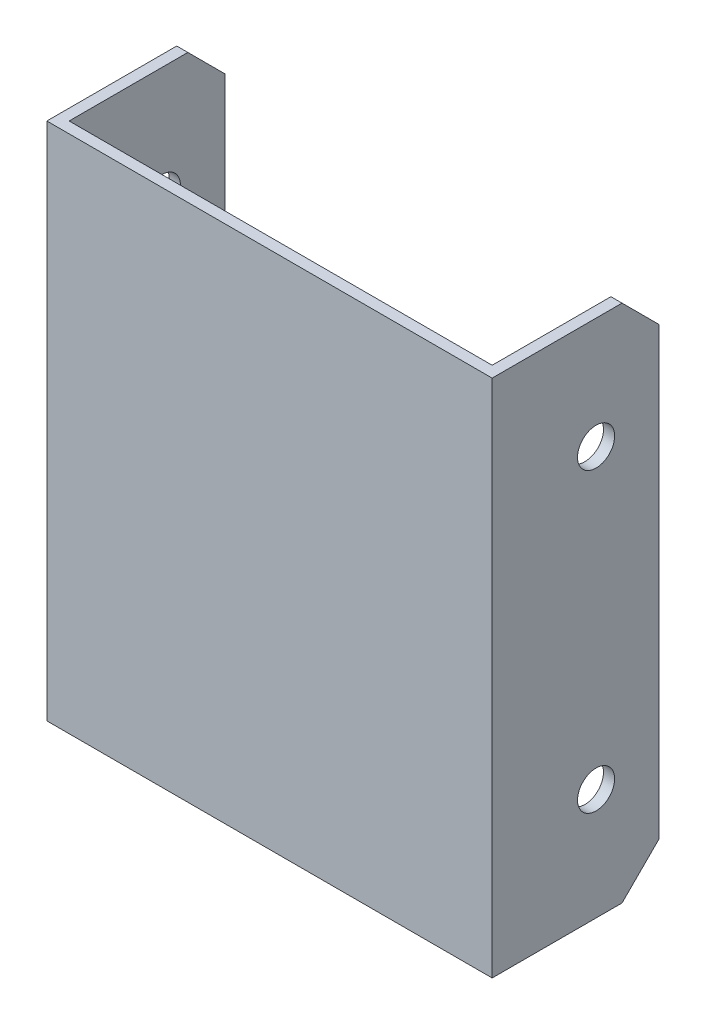
ISO-10303-21;
HEADER;
FILE_DESCRIPTION(('STEP AP214'),'2;1');
FILE_NAME('part.step','',(''),(''),'','','');
FILE_SCHEMA(('AUTOMOTIVE_DESIGN { 1 0 10303 214 1 1 1 1 }'));
ENDSEC;
DATA;
#1=APPLICATION_CONTEXT('core data for automotive mechanical design processes');
#2=APPLICATION_PROTOCOL_DEFINITION('international standard','automotive_design',2000,#1);
#3=PRODUCT_CONTEXT('',#1,'mechanical');
#4=PRODUCT('Part','Part','',(#3));
#5=PRODUCT_RELATED_PRODUCT_CATEGORY('part','',(#4));
#6=PRODUCT_DEFINITION_FORMATION('','',#4);
#7=PRODUCT_DEFINITION_CONTEXT('part definition',#1,'design');
#8=PRODUCT_DEFINITION('design','',#6,#7);
#9=PRODUCT_DEFINITION_SHAPE('','',#8);
#10=(LENGTH_UNIT() NAMED_UNIT(*) SI_UNIT(.MILLI.,.METRE.));
#11=(NAMED_UNIT(*) PLANE_ANGLE_UNIT() SI_UNIT($,.RADIAN.));
#12=(NAMED_UNIT(*) SI_UNIT($,.STERADIAN.) SOLID_ANGLE_UNIT());
#13=UNCERTAINTY_MEASURE_WITH_UNIT(LENGTH_MEASURE(1.E-05),#10,'distance_accuracy_value','');
#14=(GEOMETRIC_REPRESENTATION_CONTEXT(3) GLOBAL_UNCERTAINTY_ASSIGNED_CONTEXT((#13)) GLOBAL_UNIT_ASSIGNED_CONTEXT((#10,
#11,#12)) REPRESENTATION_CONTEXT('',''));
#15=CARTESIAN_POINT('',(0.,0.,0.));
#16=DIRECTION('',(0.,0.,1.));
#17=DIRECTION('',(1.,0.,0.));
#18=AXIS2_PLACEMENT_3D('',#15,#16,#17);
#19=CARTESIAN_POINT('',(0.,70.,0.));
#20=DIRECTION('',(-1.,0.,0.));
#21=DIRECTION('',(0.,0.,1.));
#22=AXIS2_PLACEMENT_3D('',#19,#20,#21);
#23=PLANE('',#22);
#24=CARTESIAN_POINT('',(0.,55.,-14.));
#25=DIRECTION('',(1.,0.,0.));
#26=DIRECTION('',(0.,0.,-1.));
#27=AXIS2_PLACEMENT_3D('',#24,#25,#26);
#28=CIRCLE('',#27,2.5);
#29=CARTESIAN_POINT('',(0.,55.,-16.5));
#30=VERTEX_POINT('',#29);
#31=EDGE_CURVE('E197',#30,#30,#28,.T.);
#32=ORIENTED_EDGE('',*,*,#31,.T.);
#33=EDGE_LOOP('',(#32));
#34=FACE_BOUND('',#33,.T.);
#35=CARTESIAN_POINT('',(0.,15.,-14.));
#36=DIRECTION('',(1.,0.,0.));
#37=DIRECTION('',(0.,0.,1.));
#38=AXIS2_PLACEMENT_3D('',#35,#36,#37);
#39=CIRCLE('',#38,2.49999999999999);
#40=CARTESIAN_POINT('',(0.,15.,-11.5));
#41=VERTEX_POINT('',#40);
#42=EDGE_CURVE('E346',#41,#41,#39,.T.);
#43=ORIENTED_EDGE('',*,*,#42,.T.);
#44=EDGE_LOOP('',(#43));
#45=FACE_BOUND('',#44,.T.);
#46=DIRECTION('',(0.,0.,-1.));
#47=VECTOR('',#46,1.);
#48=CARTESIAN_POINT('',(0.,70.,0.));
#49=LINE('',#48,#47);
#50=CARTESIAN_POINT('',(0.,70.,0.));
#51=VERTEX_POINT('',#50);
#52=CARTESIAN_POINT('',(0.,70.,-17.5));
#53=VERTEX_POINT('',#52);
#54=EDGE_CURVE('E147',#51,#53,#49,.T.);
#55=ORIENTED_EDGE('',*,*,#54,.T.);
#56=DIRECTION('',(0.,-0.707106781186546,-0.707106781186549));
#57=VECTOR('',#56,1.);
#58=CARTESIAN_POINT('',(0.,78.75,-8.74999999999995));
#59=LINE('',#58,#57);
#60=CARTESIAN_POINT('',(0.,65.,-22.5));
#61=VERTEX_POINT('',#60);
#62=EDGE_CURVE('E225',#53,#61,#59,.T.);
#63=ORIENTED_EDGE('',*,*,#62,.T.);
#64=DIRECTION('',(0.,-1.,0.));
#65=VECTOR('',#64,1.);
#66=CARTESIAN_POINT('',(0.,70.,-22.5));
#67=LINE('',#66,#65);
#68=CARTESIAN_POINT('',(0.,5.00000000000002,-22.5));
#69=VERTEX_POINT('',#68);
#70=EDGE_CURVE('E162',#61,#69,#67,.T.);
#71=ORIENTED_EDGE('',*,*,#70,.T.);
#72=DIRECTION('',(0.,0.707106781186549,-0.707106781186547));
#73=VECTOR('',#72,1.);
#74=CARTESIAN_POINT('',(0.,26.2500000000001,-43.75));
#75=LINE('',#74,#73);
#76=CARTESIAN_POINT('',(0.,0.,-17.5));
#77=VERTEX_POINT('',#76);
#78=EDGE_CURVE('E51',#69,#77,#75,.F.);
#79=ORIENTED_EDGE('',*,*,#78,.T.);
#80=DIRECTION('',(0.,0.,-1.));
#81=VECTOR('',#80,1.);
#82=CARTESIAN_POINT('',(0.,0.,0.));
#83=LINE('',#82,#81);
#84=CARTESIAN_POINT('',(0.,0.,0.));
#85=VERTEX_POINT('',#84);
#86=EDGE_CURVE('E163',#85,#77,#83,.T.);
#87=ORIENTED_EDGE('',*,*,#86,.F.);
#88=DIRECTION('',(0.,-1.,0.));
#89=VECTOR('',#88,1.);
#90=CARTESIAN_POINT('',(0.,70.,0.));
#91=LINE('',#90,#89);
#92=EDGE_CURVE('E177',#51,#85,#91,.T.);
#93=ORIENTED_EDGE('',*,*,#92,.F.);
#94=EDGE_LOOP('',(#55,#63,#71,#79,#87,#93));
#95=FACE_BOUND('',#94,.T.);
#96=ADVANCED_FACE('F35',(#34,#45,#95),#23,.T.);
#97=CARTESIAN_POINT('',(0.,70.,0.));
#98=DIRECTION('',(0.,0.,-1.));
#99=DIRECTION('',(-1.,0.,0.));
#100=AXIS2_PLACEMENT_3D('',#97,#98,#99);
#101=PLANE('',#100);
#102=DIRECTION('',(1.,0.,0.));
#103=VECTOR('',#102,1.);
#104=CARTESIAN_POINT('',(0.,0.,0.));
#105=LINE('',#104,#103);
#106=CARTESIAN_POINT('',(60.,0.,0.));
#107=VERTEX_POINT('',#106);
#108=EDGE_CURVE('E175',#85,#107,#105,.T.);
#109=ORIENTED_EDGE('',*,*,#108,.T.);
#110=DIRECTION('',(0.,-1.,0.));
#111=VECTOR('',#110,1.);
#112=CARTESIAN_POINT('',(60.,70.,0.));
#113=LINE('',#112,#111);
#114=CARTESIAN_POINT('',(60.,70.,0.));
#115=VERTEX_POINT('',#114);
#116=EDGE_CURVE('E180',#115,#107,#113,.T.);
#117=ORIENTED_EDGE('',*,*,#116,.F.);
#118=DIRECTION('',(1.,0.,0.));
#119=VECTOR('',#118,1.);
#120=CARTESIAN_POINT('',(0.,70.,0.));
#121=LINE('',#120,#119);
#122=EDGE_CURVE('E160',#51,#115,#121,.T.);
#123=ORIENTED_EDGE('',*,*,#122,.F.);
#124=ORIENTED_EDGE('',*,*,#92,.T.);
#125=EDGE_LOOP('',(#109,#117,#123,#124));
#126=FACE_BOUND('',#125,.T.);
#127=ADVANCED_FACE('F242',(#126),#101,.F.);
#128=CARTESIAN_POINT('',(60.,70.,0.));
#129=DIRECTION('',(-1.,0.,0.));
#130=DIRECTION('',(0.,0.,1.));
#131=AXIS2_PLACEMENT_3D('',#128,#129,#130);
#132=PLANE('',#131);
#133=CARTESIAN_POINT('',(60.,55.,-14.));
#134=DIRECTION('',(1.,0.,0.));
#135=DIRECTION('',(0.,0.,-1.));
#136=AXIS2_PLACEMENT_3D('',#133,#134,#135);
#137=CIRCLE('',#136,2.5);
#138=CARTESIAN_POINT('',(60.,55.,-16.5));
#139=VERTEX_POINT('',#138);
#140=EDGE_CURVE('E349',#139,#139,#137,.T.);
#141=ORIENTED_EDGE('',*,*,#140,.F.);
#142=EDGE_LOOP('',(#141));
#143=FACE_BOUND('',#142,.T.);
#144=CARTESIAN_POINT('',(60.,15.,-14.));
#145=DIRECTION('',(1.,0.,0.));
#146=DIRECTION('',(0.,0.,1.));
#147=AXIS2_PLACEMENT_3D('',#144,#145,#146);
#148=CIRCLE('',#147,2.49999999999999);
#149=CARTESIAN_POINT('',(60.,15.,-11.5));
#150=VERTEX_POINT('',#149);
#151=EDGE_CURVE('E344',#150,#150,#148,.T.);
#152=ORIENTED_EDGE('',*,*,#151,.F.);
#153=EDGE_LOOP('',(#152));
#154=FACE_BOUND('',#153,.T.);
#155=DIRECTION('',(0.,-1.,0.));
#156=VECTOR('',#155,1.);
#157=CARTESIAN_POINT('',(60.,70.,-22.5));
#158=LINE('',#157,#156);
#159=CARTESIAN_POINT('',(60.,65.,-22.5));
#160=VERTEX_POINT('',#159);
#161=CARTESIAN_POINT('',(60.,5.00000000000002,-22.5));
#162=VERTEX_POINT('',#161);
#163=EDGE_CURVE('E183',#160,#162,#158,.T.);
#164=ORIENTED_EDGE('',*,*,#163,.F.);
#165=DIRECTION('',(0.,0.707106781186546,0.707106781186549));
#166=VECTOR('',#165,1.);
#167=CARTESIAN_POINT('',(60.,65.,-22.5));
#168=LINE('',#167,#166);
#169=CARTESIAN_POINT('',(60.,70.,-17.5));
#170=VERTEX_POINT('',#169);
#171=EDGE_CURVE('E207',#160,#170,#168,.T.);
#172=ORIENTED_EDGE('',*,*,#171,.T.);
#173=DIRECTION('',(0.,0.,-1.));
#174=VECTOR('',#173,1.);
#175=CARTESIAN_POINT('',(60.,70.,0.));
#176=LINE('',#175,#174);
#177=EDGE_CURVE('E155',#115,#170,#176,.T.);
#178=ORIENTED_EDGE('',*,*,#177,.F.);
#179=ORIENTED_EDGE('',*,*,#116,.T.);
#180=DIRECTION('',(0.,0.,-1.));
#181=VECTOR('',#180,1.);
#182=CARTESIAN_POINT('',(60.,0.,0.));
#183=LINE('',#182,#181);
#184=CARTESIAN_POINT('',(60.,0.,-17.5));
#185=VERTEX_POINT('',#184);
#186=EDGE_CURVE('E172',#107,#185,#183,.T.);
#187=ORIENTED_EDGE('',*,*,#186,.T.);
#188=DIRECTION('',(0.,-0.707106781186549,0.707106781186547));
#189=VECTOR('',#188,1.);
#190=CARTESIAN_POINT('',(60.,0.,-17.5));
#191=LINE('',#190,#189);
#192=EDGE_CURVE('E205',#185,#162,#191,.F.);
#193=ORIENTED_EDGE('',*,*,#192,.T.);
#194=EDGE_LOOP('',(#164,#172,#178,#179,#187,#193));
#195=FACE_BOUND('',#194,.T.);
#196=ADVANCED_FACE('F237',(#143,#154,#195),#132,.F.);
#197=CARTESIAN_POINT('',(58.5,70.,-22.5));
#198=DIRECTION('',(0.,0.,-1.));
#199=DIRECTION('',(-1.,0.,0.));
#200=AXIS2_PLACEMENT_3D('',#197,#198,#199);
#201=PLANE('',#200);
#202=DIRECTION('',(0.,-1.,0.));
#203=VECTOR('',#202,1.);
#204=CARTESIAN_POINT('',(58.5,70.,-22.5));
#205=LINE('',#204,#203);
#206=CARTESIAN_POINT('',(58.5,65.,-22.5));
#207=VERTEX_POINT('',#206);
#208=CARTESIAN_POINT('',(58.5,5.00000000000002,-22.5));
#209=VERTEX_POINT('',#208);
#210=EDGE_CURVE('E186',#207,#209,#205,.T.);
#211=ORIENTED_EDGE('',*,*,#210,.F.);
#212=DIRECTION('',(1.,0.,0.));
#213=VECTOR('',#212,1.);
#214=CARTESIAN_POINT('',(60.,65.,-22.5));
#215=LINE('',#214,#213);
#216=EDGE_CURVE('E202',#207,#160,#215,.T.);
#217=ORIENTED_EDGE('',*,*,#216,.T.);
#218=ORIENTED_EDGE('',*,*,#163,.T.);
#219=DIRECTION('',(-1.,0.,0.));
#220=VECTOR('',#219,1.);
#221=CARTESIAN_POINT('',(58.5,5.00000000000002,-22.5));
#222=LINE('',#221,#220);
#223=EDGE_CURVE('E179',#162,#209,#222,.T.);
#224=ORIENTED_EDGE('',*,*,#223,.T.);
#225=EDGE_LOOP('',(#211,#217,#218,#224));
#226=FACE_BOUND('',#225,.T.);
#227=ADVANCED_FACE('F300',(#226),#201,.T.);
#228=CARTESIAN_POINT('',(58.5,70.,-1.5));
#229=DIRECTION('',(-1.,0.,0.));
#230=DIRECTION('',(0.,0.,1.));
#231=AXIS2_PLACEMENT_3D('',#228,#229,#230);
#232=PLANE('',#231);
#233=CARTESIAN_POINT('',(58.5,55.,-14.));
#234=DIRECTION('',(-1.,0.,0.));
#235=DIRECTION('',(0.,0.,1.));
#236=AXIS2_PLACEMENT_3D('',#233,#234,#235);
#237=CIRCLE('',#236,2.5);
#238=CARTESIAN_POINT('',(58.5,55.,-11.5));
#239=VERTEX_POINT('',#238);
#240=EDGE_CURVE('E166',#239,#239,#237,.T.);
#241=ORIENTED_EDGE('',*,*,#240,.F.);
#242=EDGE_LOOP('',(#241));
#243=FACE_BOUND('',#242,.T.);
#244=CARTESIAN_POINT('',(58.5,15.,-14.));
#245=DIRECTION('',(-1.,0.,0.));
#246=DIRECTION('',(0.,0.,1.));
#247=AXIS2_PLACEMENT_3D('',#244,#245,#246);
#248=CIRCLE('',#247,2.49999999999999);
#249=CARTESIAN_POINT('',(58.5,15.,-11.5));
#250=VERTEX_POINT('',#249);
#251=EDGE_CURVE('E196',#250,#250,#248,.T.);
#252=ORIENTED_EDGE('',*,*,#251,.F.);
#253=EDGE_LOOP('',(#252));
#254=FACE_BOUND('',#253,.T.);
#255=DIRECTION('',(0.,0.,-1.));
#256=VECTOR('',#255,1.);
#257=CARTESIAN_POINT('',(58.5,70.,-1.5));
#258=LINE('',#257,#256);
#259=CARTESIAN_POINT('',(58.5,70.,-1.5));
#260=VERTEX_POINT('',#259);
#261=CARTESIAN_POINT('',(58.5,70.,-17.5));
#262=VERTEX_POINT('',#261);
#263=EDGE_CURVE('E153',#260,#262,#258,.T.);
#264=ORIENTED_EDGE('',*,*,#263,.T.);
#265=DIRECTION('',(0.,-0.707106781186546,-0.707106781186549));
#266=VECTOR('',#265,1.);
#267=CARTESIAN_POINT('',(58.5,78.,-9.49999999999995));
#268=LINE('',#267,#266);
#269=EDGE_CURVE('E215',#262,#207,#268,.T.);
#270=ORIENTED_EDGE('',*,*,#269,.T.);
#271=ORIENTED_EDGE('',*,*,#210,.T.);
#272=DIRECTION('',(0.,0.707106781186549,-0.707106781186547));
#273=VECTOR('',#272,1.);
#274=CARTESIAN_POINT('',(58.5,27.0000000000001,-44.5));
#275=LINE('',#274,#273);
#276=CARTESIAN_POINT('',(58.5,0.,-17.5));
#277=VERTEX_POINT('',#276);
#278=EDGE_CURVE('E213',#209,#277,#275,.F.);
#279=ORIENTED_EDGE('',*,*,#278,.T.);
#280=DIRECTION('',(0.,0.,-1.));
#281=VECTOR('',#280,1.);
#282=CARTESIAN_POINT('',(58.5,0.,-1.5));
#283=LINE('',#282,#281);
#284=CARTESIAN_POINT('',(58.5,0.,-1.5));
#285=VERTEX_POINT('',#284);
#286=EDGE_CURVE('E169',#285,#277,#283,.T.);
#287=ORIENTED_EDGE('',*,*,#286,.F.);
#288=DIRECTION('',(0.,-1.,0.));
#289=VECTOR('',#288,1.);
#290=CARTESIAN_POINT('',(58.5,70.,-1.5));
#291=LINE('',#290,#289);
#292=EDGE_CURVE('E137',#260,#285,#291,.T.);
#293=ORIENTED_EDGE('',*,*,#292,.F.);
#294=EDGE_LOOP('',(#264,#270,#271,#279,#287,#293));
#295=FACE_BOUND('',#294,.T.);
#296=ADVANCED_FACE('F298',(#243,#254,#295),#232,.T.);
#297=CARTESIAN_POINT('',(1.5,70.,-1.5));
#298=DIRECTION('',(0.,0.,-1.));
#299=DIRECTION('',(-1.,0.,0.));
#300=AXIS2_PLACEMENT_3D('',#297,#298,#299);
#301=PLANE('',#300);
#302=DIRECTION('',(1.,0.,0.));
#303=VECTOR('',#302,1.);
#304=CARTESIAN_POINT('',(1.5,0.,-1.5));
#305=LINE('',#304,#303);
#306=CARTESIAN_POINT('',(1.5,0.,-1.5));
#307=VERTEX_POINT('',#306);
#308=EDGE_CURVE('E133',#307,#285,#305,.T.);
#309=ORIENTED_EDGE('',*,*,#308,.F.);
#310=DIRECTION('',(0.,-1.,0.));
#311=VECTOR('',#310,1.);
#312=CARTESIAN_POINT('',(1.5,70.,-1.5));
#313=LINE('',#312,#311);
#314=CARTESIAN_POINT('',(1.5,70.,-1.5));
#315=VERTEX_POINT('',#314);
#316=EDGE_CURVE('E127',#315,#307,#313,.T.);
#317=ORIENTED_EDGE('',*,*,#316,.F.);
#318=DIRECTION('',(1.,0.,0.));
#319=VECTOR('',#318,1.);
#320=CARTESIAN_POINT('',(1.5,70.,-1.5));
#321=LINE('',#320,#319);
#322=EDGE_CURVE('E131',#315,#260,#321,.T.);
#323=ORIENTED_EDGE('',*,*,#322,.T.);
#324=ORIENTED_EDGE('',*,*,#292,.T.);
#325=EDGE_LOOP('',(#309,#317,#323,#324));
#326=FACE_BOUND('',#325,.T.);
#327=ADVANCED_FACE('F129',(#326),#301,.T.);
#328=CARTESIAN_POINT('',(1.5,70.,-1.5));
#329=DIRECTION('',(-1.,0.,0.));
#330=DIRECTION('',(0.,0.,1.));
#331=AXIS2_PLACEMENT_3D('',#328,#329,#330);
#332=PLANE('',#331);
#333=CARTESIAN_POINT('',(1.5,55.,-14.));
#334=DIRECTION('',(-1.,0.,0.));
#335=DIRECTION('',(0.,0.,1.));
#336=AXIS2_PLACEMENT_3D('',#333,#334,#335);
#337=CIRCLE('',#336,2.5);
#338=CARTESIAN_POINT('',(1.5,55.,-11.5));
#339=VERTEX_POINT('',#338);
#340=EDGE_CURVE('E198',#339,#339,#337,.T.);
#341=ORIENTED_EDGE('',*,*,#340,.T.);
#342=EDGE_LOOP('',(#341));
#343=FACE_BOUND('',#342,.T.);
#344=CARTESIAN_POINT('',(1.5,15.,-14.));
#345=DIRECTION('',(-1.,0.,0.));
#346=DIRECTION('',(0.,0.,1.));
#347=AXIS2_PLACEMENT_3D('',#344,#345,#346);
#348=CIRCLE('',#347,2.49999999999999);
#349=CARTESIAN_POINT('',(1.5,15.,-11.5));
#350=VERTEX_POINT('',#349);
#351=EDGE_CURVE('E193',#350,#350,#348,.T.);
#352=ORIENTED_EDGE('',*,*,#351,.T.);
#353=EDGE_LOOP('',(#352));
#354=FACE_BOUND('',#353,.T.);
#355=DIRECTION('',(0.,-1.,0.));
#356=VECTOR('',#355,1.);
#357=CARTESIAN_POINT('',(1.5,70.,-22.5));
#358=LINE('',#357,#356);
#359=CARTESIAN_POINT('',(1.5,65.,-22.5));
#360=VERTEX_POINT('',#359);
#361=CARTESIAN_POINT('',(1.5,5.00000000000002,-22.5));
#362=VERTEX_POINT('',#361);
#363=EDGE_CURVE('E138',#360,#362,#358,.T.);
#364=ORIENTED_EDGE('',*,*,#363,.F.);
#365=DIRECTION('',(0.,0.707106781186546,0.707106781186549));
#366=VECTOR('',#365,1.);
#367=CARTESIAN_POINT('',(1.5,65.,-22.5));
#368=LINE('',#367,#366);
#369=CARTESIAN_POINT('',(1.5,70.,-17.5));
#370=VERTEX_POINT('',#369);
#371=EDGE_CURVE('E144',#360,#370,#368,.T.);
#372=ORIENTED_EDGE('',*,*,#371,.T.);
#373=DIRECTION('',(0.,0.,-1.));
#374=VECTOR('',#373,1.);
#375=CARTESIAN_POINT('',(1.5,70.,-1.5));
#376=LINE('',#375,#374);
#377=EDGE_CURVE('E141',#315,#370,#376,.T.);
#378=ORIENTED_EDGE('',*,*,#377,.F.);
#379=ORIENTED_EDGE('',*,*,#316,.T.);
#380=DIRECTION('',(0.,0.,-1.));
#381=VECTOR('',#380,1.);
#382=CARTESIAN_POINT('',(1.5,0.,-1.5));
#383=LINE('',#382,#381);
#384=CARTESIAN_POINT('',(1.5,0.,-17.5));
#385=VERTEX_POINT('',#384);
#386=EDGE_CURVE('E165',#307,#385,#383,.T.);
#387=ORIENTED_EDGE('',*,*,#386,.T.);
#388=DIRECTION('',(0.,-0.707106781186549,0.707106781186547));
#389=VECTOR('',#388,1.);
#390=CARTESIAN_POINT('',(1.5,0.,-17.5));
#391=LINE('',#390,#389);
#392=EDGE_CURVE('E59',#385,#362,#391,.F.);
#393=ORIENTED_EDGE('',*,*,#392,.T.);
#394=EDGE_LOOP('',(#364,#372,#378,#379,#387,#393));
#395=FACE_BOUND('',#394,.T.);
#396=ADVANCED_FACE('F143',(#343,#354,#395),#332,.F.);
#397=CARTESIAN_POINT('',(0.,70.,-22.5));
#398=DIRECTION('',(0.,0.,-1.));
#399=DIRECTION('',(-1.,0.,0.));
#400=AXIS2_PLACEMENT_3D('',#397,#398,#399);
#401=PLANE('',#400);
#402=ORIENTED_EDGE('',*,*,#70,.F.);
#403=DIRECTION('',(1.,0.,0.));
#404=VECTOR('',#403,1.);
#405=CARTESIAN_POINT('',(1.5,65.,-22.5));
#406=LINE('',#405,#404);
#407=EDGE_CURVE('E219',#61,#360,#406,.T.);
#408=ORIENTED_EDGE('',*,*,#407,.T.);
#409=ORIENTED_EDGE('',*,*,#363,.T.);
#410=DIRECTION('',(-1.,0.,0.));
#411=VECTOR('',#410,1.);
#412=CARTESIAN_POINT('',(0.,5.00000000000002,-22.5));
#413=LINE('',#412,#411);
#414=EDGE_CURVE('E217',#362,#69,#413,.T.);
#415=ORIENTED_EDGE('',*,*,#414,.T.);
#416=EDGE_LOOP('',(#402,#408,#409,#415));
#417=FACE_BOUND('',#416,.T.);
#418=ADVANCED_FACE('F251',(#417),#401,.T.);
#419=CARTESIAN_POINT('',(0.,70.,0.));
#420=DIRECTION('',(0.,-1.,0.));
#421=DIRECTION('',(0.,0.,-1.));
#422=AXIS2_PLACEMENT_3D('',#419,#420,#421);
#423=PLANE('',#422);
#424=ORIENTED_EDGE('',*,*,#177,.T.);
#425=DIRECTION('',(-1.,0.,0.));
#426=VECTOR('',#425,1.);
#427=CARTESIAN_POINT('',(58.5,70.,-17.5));
#428=LINE('',#427,#426);
#429=EDGE_CURVE('E211',#170,#262,#428,.T.);
#430=ORIENTED_EDGE('',*,*,#429,.T.);
#431=ORIENTED_EDGE('',*,*,#263,.F.);
#432=ORIENTED_EDGE('',*,*,#322,.F.);
#433=ORIENTED_EDGE('',*,*,#377,.T.);
#434=DIRECTION('',(-1.,0.,0.));
#435=VECTOR('',#434,1.);
#436=CARTESIAN_POINT('',(0.,70.,-17.5));
#437=LINE('',#436,#435);
#438=EDGE_CURVE('E209',#370,#53,#437,.T.);
#439=ORIENTED_EDGE('',*,*,#438,.T.);
#440=ORIENTED_EDGE('',*,*,#54,.F.);
#441=ORIENTED_EDGE('',*,*,#122,.T.);
#442=EDGE_LOOP('',(#424,#430,#431,#432,#433,#439,#440,#441));
#443=FACE_BOUND('',#442,.T.);
#444=ADVANCED_FACE('F151',(#443),#423,.F.);
#445=CARTESIAN_POINT('',(0.,0.,0.));
#446=DIRECTION('',(0.,-1.,0.));
#447=DIRECTION('',(0.,0.,-1.));
#448=AXIS2_PLACEMENT_3D('',#445,#446,#447);
#449=PLANE('',#448);
#450=ORIENTED_EDGE('',*,*,#86,.T.);
#451=DIRECTION('',(1.,0.,0.));
#452=VECTOR('',#451,1.);
#453=CARTESIAN_POINT('',(0.,0.,-17.5));
#454=LINE('',#453,#452);
#455=EDGE_CURVE('E11',#77,#385,#454,.T.);
#456=ORIENTED_EDGE('',*,*,#455,.T.);
#457=ORIENTED_EDGE('',*,*,#386,.F.);
#458=ORIENTED_EDGE('',*,*,#308,.T.);
#459=ORIENTED_EDGE('',*,*,#286,.T.);
#460=DIRECTION('',(1.,0.,0.));
#461=VECTOR('',#460,1.);
#462=CARTESIAN_POINT('',(0.,0.,-17.5));
#463=LINE('',#462,#461);
#464=EDGE_CURVE('E44',#277,#185,#463,.T.);
#465=ORIENTED_EDGE('',*,*,#464,.T.);
#466=ORIENTED_EDGE('',*,*,#186,.F.);
#467=ORIENTED_EDGE('',*,*,#108,.F.);
#468=EDGE_LOOP('',(#450,#456,#457,#458,#459,#465,#466,#467));
#469=FACE_BOUND('',#468,.T.);
#470=ADVANCED_FACE('F230',(#469),#449,.T.);
#471=CARTESIAN_POINT('',(0.,15.,-14.));
#472=DIRECTION('',(1.,0.,0.));
#473=DIRECTION('',(0.,0.,-1.));
#474=AXIS2_PLACEMENT_3D('',#471,#472,#473);
#475=CYLINDRICAL_SURFACE('',#474,2.49999999999999);
#476=ORIENTED_EDGE('',*,*,#42,.F.);
#477=EDGE_LOOP('',(#476));
#478=FACE_BOUND('',#477,.T.);
#479=ORIENTED_EDGE('',*,*,#351,.F.);
#480=EDGE_LOOP('',(#479));
#481=FACE_BOUND('',#480,.T.);
#482=ADVANCED_FACE('F323',(#478,#481),#475,.F.);
#483=CARTESIAN_POINT('',(0.,55.,-14.));
#484=DIRECTION('',(1.,0.,0.));
#485=DIRECTION('',(0.,0.,-1.));
#486=AXIS2_PLACEMENT_3D('',#483,#484,#485);
#487=CYLINDRICAL_SURFACE('',#486,2.5);
#488=ORIENTED_EDGE('',*,*,#31,.F.);
#489=EDGE_LOOP('',(#488));
#490=FACE_BOUND('',#489,.T.);
#491=ORIENTED_EDGE('',*,*,#340,.F.);
#492=EDGE_LOOP('',(#491));
#493=FACE_BOUND('',#492,.T.);
#494=ADVANCED_FACE('F292',(#490,#493),#487,.F.);
#495=ORIENTED_EDGE('',*,*,#251,.T.);
#496=EDGE_LOOP('',(#495));
#497=FACE_BOUND('',#496,.T.);
#498=ORIENTED_EDGE('',*,*,#151,.T.);
#499=EDGE_LOOP('',(#498));
#500=FACE_BOUND('',#499,.T.);
#501=ADVANCED_FACE('F289',(#497,#500),#475,.F.);
#502=ORIENTED_EDGE('',*,*,#240,.T.);
#503=EDGE_LOOP('',(#502));
#504=FACE_BOUND('',#503,.T.);
#505=ORIENTED_EDGE('',*,*,#140,.T.);
#506=EDGE_LOOP('',(#505));
#507=FACE_BOUND('',#506,.T.);
#508=ADVANCED_FACE('F278',(#504,#507),#487,.F.);
#509=CARTESIAN_POINT('',(58.5,65.,-22.5));
#510=DIRECTION('',(0.,0.707106781186549,-0.707106781186546));
#511=DIRECTION('',(-1.,0.,0.));
#512=AXIS2_PLACEMENT_3D('',#509,#510,#511);
#513=PLANE('',#512);
#514=ORIENTED_EDGE('',*,*,#269,.F.);
#515=ORIENTED_EDGE('',*,*,#429,.F.);
#516=ORIENTED_EDGE('',*,*,#171,.F.);
#517=ORIENTED_EDGE('',*,*,#216,.F.);
#518=EDGE_LOOP('',(#514,#515,#516,#517));
#519=FACE_BOUND('',#518,.T.);
#520=ADVANCED_FACE('F258',(#519),#513,.T.);
#521=CARTESIAN_POINT('',(0.,65.,-22.5));
#522=DIRECTION('',(0.,0.707106781186549,-0.707106781186546));
#523=DIRECTION('',(-1.,0.,0.));
#524=AXIS2_PLACEMENT_3D('',#521,#522,#523);
#525=PLANE('',#524);
#526=ORIENTED_EDGE('',*,*,#62,.F.);
#527=ORIENTED_EDGE('',*,*,#438,.F.);
#528=ORIENTED_EDGE('',*,*,#371,.F.);
#529=ORIENTED_EDGE('',*,*,#407,.F.);
#530=EDGE_LOOP('',(#526,#527,#528,#529));
#531=FACE_BOUND('',#530,.T.);
#532=ADVANCED_FACE('F249',(#531),#525,.T.);
#533=CARTESIAN_POINT('',(0.,0.,-17.5));
#534=DIRECTION('',(0.,0.707106781186547,0.707106781186549));
#535=DIRECTION('',(1.,0.,0.));
#536=AXIS2_PLACEMENT_3D('',#533,#534,#535);
#537=PLANE('',#536);
#538=ORIENTED_EDGE('',*,*,#78,.F.);
#539=ORIENTED_EDGE('',*,*,#414,.F.);
#540=ORIENTED_EDGE('',*,*,#392,.F.);
#541=ORIENTED_EDGE('',*,*,#455,.F.);
#542=EDGE_LOOP('',(#538,#539,#540,#541));
#543=FACE_BOUND('',#542,.T.);
#544=ADVANCED_FACE('F252',(#543),#537,.F.);
#545=CARTESIAN_POINT('',(0.,0.,-17.5));
#546=DIRECTION('',(0.,0.707106781186547,0.707106781186549));
#547=DIRECTION('',(1.,0.,0.));
#548=AXIS2_PLACEMENT_3D('',#545,#546,#547);
#549=PLANE('',#548);
#550=ORIENTED_EDGE('',*,*,#278,.F.);
#551=ORIENTED_EDGE('',*,*,#223,.F.);
#552=ORIENTED_EDGE('',*,*,#192,.F.);
#553=ORIENTED_EDGE('',*,*,#464,.F.);
#554=EDGE_LOOP('',(#550,#551,#552,#553));
#555=FACE_BOUND('',#554,.T.);
#556=ADVANCED_FACE('F38',(#555),#549,.F.);
#557=CLOSED_SHELL('',(#96,#127,#196,#227,#296,#327,#396,#418,#444,#470,#482,#494,#501,#508,#520,
#532,#544,#556));
#558=MANIFOLD_SOLID_BREP('B2',#557);
#559=ADVANCED_BREP_SHAPE_REPRESENTATION('',(#18,#558),#14);
#560=SHAPE_DEFINITION_REPRESENTATION(#9,#559);
ENDSEC;
END-ISO-10303-21;
